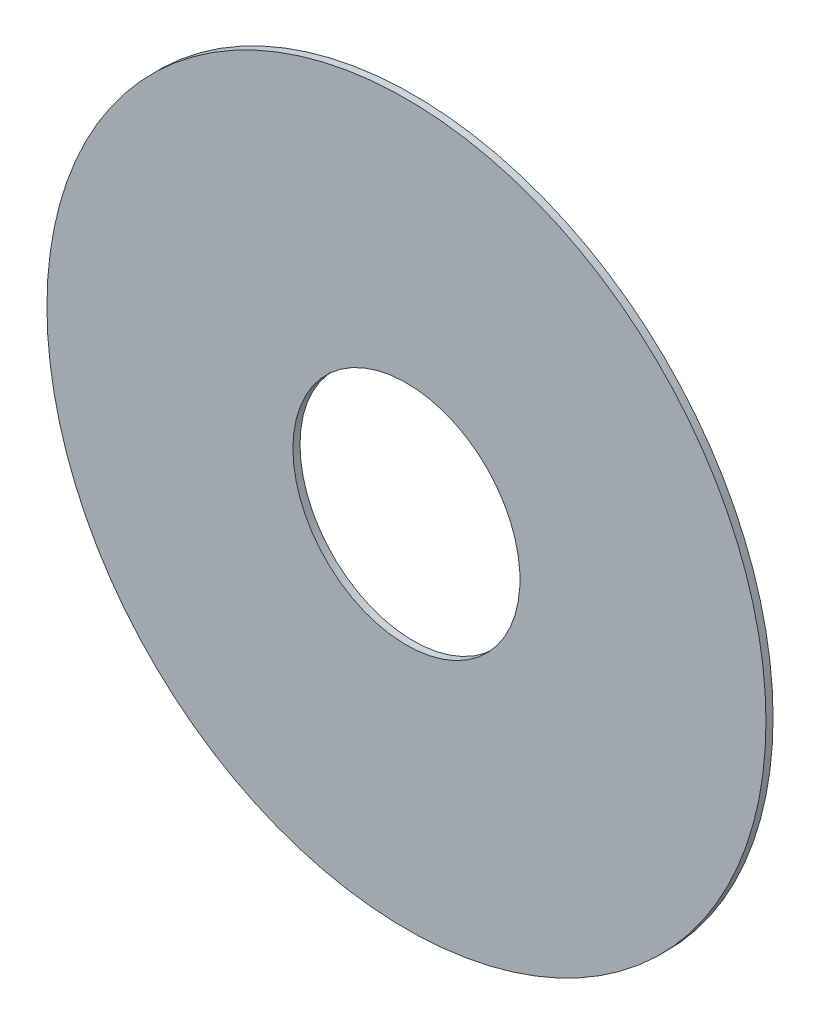
ISO-10303-21;
HEADER;
FILE_DESCRIPTION(('STEP AP214'),'2;1');
FILE_NAME('part.step','',(''),(''),'','','');
FILE_SCHEMA(('AUTOMOTIVE_DESIGN { 1 0 10303 214 1 1 1 1 }'));
ENDSEC;
DATA;
#1=APPLICATION_CONTEXT('core data for automotive mechanical design processes');
#2=APPLICATION_PROTOCOL_DEFINITION('international standard','automotive_design',2000,#1);
#3=PRODUCT_CONTEXT('',#1,'mechanical');
#4=PRODUCT('Part','Part','',(#3));
#5=PRODUCT_RELATED_PRODUCT_CATEGORY('part','',(#4));
#6=PRODUCT_DEFINITION_FORMATION('','',#4);
#7=PRODUCT_DEFINITION_CONTEXT('part definition',#1,'design');
#8=PRODUCT_DEFINITION('design','',#6,#7);
#9=PRODUCT_DEFINITION_SHAPE('','',#8);
#10=(LENGTH_UNIT() NAMED_UNIT(*) SI_UNIT(.MILLI.,.METRE.));
#11=(NAMED_UNIT(*) PLANE_ANGLE_UNIT() SI_UNIT($,.RADIAN.));
#12=(NAMED_UNIT(*) SI_UNIT($,.STERADIAN.) SOLID_ANGLE_UNIT());
#13=UNCERTAINTY_MEASURE_WITH_UNIT(LENGTH_MEASURE(1.E-05),#10,'distance_accuracy_value','');
#14=(GEOMETRIC_REPRESENTATION_CONTEXT(3) GLOBAL_UNCERTAINTY_ASSIGNED_CONTEXT((#13)) GLOBAL_UNIT_ASSIGNED_CONTEXT((#10,
#11,#12)) REPRESENTATION_CONTEXT('',''));
#15=CARTESIAN_POINT('',(0.,0.,0.));
#16=DIRECTION('',(0.,0.,1.));
#17=DIRECTION('',(1.,0.,0.));
#18=AXIS2_PLACEMENT_3D('',#15,#16,#17);
#19=CARTESIAN_POINT('',(0.,0.,4.7625));
#20=DIRECTION('',(0.,0.,1.));
#21=DIRECTION('',(1.,0.,0.));
#22=AXIS2_PLACEMENT_3D('',#19,#20,#21);
#23=PLANE('',#22);
#24=CARTESIAN_POINT('',(0.,0.,4.7625));
#25=DIRECTION('',(0.,0.,1.));
#26=DIRECTION('',(1.,0.,0.));
#27=AXIS2_PLACEMENT_3D('',#24,#25,#26);
#28=CIRCLE('',#27,241.3);
#29=CARTESIAN_POINT('',(-241.3,0.,4.7625));
#30=VERTEX_POINT('',#29);
#31=EDGE_CURVE('E10',#30,#30,#28,.T.);
#32=ORIENTED_EDGE('',*,*,#31,.T.);
#33=EDGE_LOOP('',(#32));
#34=FACE_BOUND('',#33,.T.);
#35=CARTESIAN_POINT('',(0.,0.,4.7625));
#36=DIRECTION('',(0.,0.,1.));
#37=DIRECTION('',(1.,0.,0.));
#38=AXIS2_PLACEMENT_3D('',#35,#36,#37);
#39=CIRCLE('',#38,76.2);
#40=CARTESIAN_POINT('',(-76.2,0.,4.7625));
#41=VERTEX_POINT('',#40);
#42=EDGE_CURVE('E50',#41,#41,#39,.T.);
#43=ORIENTED_EDGE('',*,*,#42,.F.);
#44=EDGE_LOOP('',(#43));
#45=FACE_BOUND('',#44,.T.);
#46=ADVANCED_FACE('F37',(#34,#45),#23,.T.);
#47=CARTESIAN_POINT('',(0.,0.,0.));
#48=DIRECTION('',(0.,0.,1.));
#49=DIRECTION('',(1.,0.,0.));
#50=AXIS2_PLACEMENT_3D('',#47,#48,#49);
#51=PLANE('',#50);
#52=CARTESIAN_POINT('',(0.,0.,0.));
#53=DIRECTION('',(0.,0.,1.));
#54=DIRECTION('',(1.,0.,0.));
#55=AXIS2_PLACEMENT_3D('',#52,#53,#54);
#56=CIRCLE('',#55,241.3);
#57=CARTESIAN_POINT('',(-241.3,0.,0.));
#58=VERTEX_POINT('',#57);
#59=EDGE_CURVE('E41',#58,#58,#56,.T.);
#60=ORIENTED_EDGE('',*,*,#59,.F.);
#61=EDGE_LOOP('',(#60));
#62=FACE_BOUND('',#61,.T.);
#63=CARTESIAN_POINT('',(0.,0.,0.));
#64=DIRECTION('',(0.,0.,1.));
#65=DIRECTION('',(1.,0.,0.));
#66=AXIS2_PLACEMENT_3D('',#63,#64,#65);
#67=CIRCLE('',#66,76.2);
#68=CARTESIAN_POINT('',(-76.2,0.,0.));
#69=VERTEX_POINT('',#68);
#70=EDGE_CURVE('E52',#69,#69,#67,.T.);
#71=ORIENTED_EDGE('',*,*,#70,.T.);
#72=EDGE_LOOP('',(#71));
#73=FACE_BOUND('',#72,.T.);
#74=ADVANCED_FACE('F64',(#62,#73),#51,.F.);
#75=CARTESIAN_POINT('',(0.,0.,4.7625));
#76=DIRECTION('',(0.,0.,-1.));
#77=DIRECTION('',(-1.,0.,0.));
#78=AXIS2_PLACEMENT_3D('',#75,#76,#77);
#79=CYLINDRICAL_SURFACE('',#78,241.3);
#80=CARTESIAN_POINT('',(-241.3,0.,4.7625));
#81=CARTESIAN_POINT('',(-241.3,0.,4.712890625));
#82=CARTESIAN_POINT('',(-241.3,0.,4.66328125));
#83=CARTESIAN_POINT('',(-241.3,0.,4.5640625));
#84=CARTESIAN_POINT('',(-241.3,0.,4.514453125));
#85=CARTESIAN_POINT('',(-241.3,0.,4.415234375));
#86=CARTESIAN_POINT('',(-241.3,0.,4.365625));
#87=CARTESIAN_POINT('',(-241.3,0.,4.26640625));
#88=CARTESIAN_POINT('',(-241.3,0.,4.216796875));
#89=CARTESIAN_POINT('',(-241.3,0.,4.117578125));
#90=CARTESIAN_POINT('',(-241.3,0.,4.06796875));
#91=CARTESIAN_POINT('',(-241.3,0.,3.96875));
#92=CARTESIAN_POINT('',(-241.3,0.,3.919140625));
#93=CARTESIAN_POINT('',(-241.3,0.,3.819921875));
#94=CARTESIAN_POINT('',(-241.3,0.,3.7703125));
#95=CARTESIAN_POINT('',(-241.3,0.,3.67109375));
#96=CARTESIAN_POINT('',(-241.3,0.,3.621484375));
#97=CARTESIAN_POINT('',(-241.3,0.,3.522265625));
#98=CARTESIAN_POINT('',(-241.3,0.,3.47265625));
#99=CARTESIAN_POINT('',(-241.3,0.,3.3734375));
#100=CARTESIAN_POINT('',(-241.3,0.,3.323828125));
#101=CARTESIAN_POINT('',(-241.3,0.,3.224609375));
#102=CARTESIAN_POINT('',(-241.3,0.,3.175));
#103=CARTESIAN_POINT('',(-241.3,0.,3.07578125));
#104=CARTESIAN_POINT('',(-241.3,0.,3.026171875));
#105=CARTESIAN_POINT('',(-241.3,0.,2.926953125));
#106=CARTESIAN_POINT('',(-241.3,0.,2.87734375));
#107=CARTESIAN_POINT('',(-241.3,0.,2.778125));
#108=CARTESIAN_POINT('',(-241.3,0.,2.728515625));
#109=CARTESIAN_POINT('',(-241.3,0.,2.629296875));
#110=CARTESIAN_POINT('',(-241.3,0.,2.5796875));
#111=CARTESIAN_POINT('',(-241.3,0.,2.48046875));
#112=CARTESIAN_POINT('',(-241.3,0.,2.430859375));
#113=CARTESIAN_POINT('',(-241.3,0.,2.331640625));
#114=CARTESIAN_POINT('',(-241.3,0.,2.28203125));
#115=CARTESIAN_POINT('',(-241.3,0.,2.1828125));
#116=CARTESIAN_POINT('',(-241.3,0.,2.133203125));
#117=CARTESIAN_POINT('',(-241.3,0.,2.033984375));
#118=CARTESIAN_POINT('',(-241.3,0.,1.984375));
#119=CARTESIAN_POINT('',(-241.3,0.,1.88515625));
#120=CARTESIAN_POINT('',(-241.3,0.,1.835546875));
#121=CARTESIAN_POINT('',(-241.3,0.,1.736328125));
#122=CARTESIAN_POINT('',(-241.3,0.,1.68671875));
#123=CARTESIAN_POINT('',(-241.3,0.,1.5875));
#124=CARTESIAN_POINT('',(-241.3,0.,1.537890625));
#125=CARTESIAN_POINT('',(-241.3,0.,1.438671875));
#126=CARTESIAN_POINT('',(-241.3,0.,1.3890625));
#127=CARTESIAN_POINT('',(-241.3,0.,1.28984375));
#128=CARTESIAN_POINT('',(-241.3,0.,1.240234375));
#129=CARTESIAN_POINT('',(-241.3,0.,1.141015625));
#130=CARTESIAN_POINT('',(-241.3,0.,1.09140625));
#131=CARTESIAN_POINT('',(-241.3,0.,0.9921875));
#132=CARTESIAN_POINT('',(-241.3,0.,0.942578125));
#133=CARTESIAN_POINT('',(-241.3,0.,0.843359375));
#134=CARTESIAN_POINT('',(-241.3,0.,0.79375));
#135=CARTESIAN_POINT('',(-241.3,0.,0.69453125));
#136=CARTESIAN_POINT('',(-241.3,0.,0.644921875));
#137=CARTESIAN_POINT('',(-241.3,0.,0.545703125));
#138=CARTESIAN_POINT('',(-241.3,0.,0.49609375));
#139=CARTESIAN_POINT('',(-241.3,0.,0.396875));
#140=CARTESIAN_POINT('',(-241.3,0.,0.347265625));
#141=CARTESIAN_POINT('',(-241.3,0.,0.248046875));
#142=CARTESIAN_POINT('',(-241.3,0.,0.1984375));
#143=CARTESIAN_POINT('',(-241.3,0.,0.09921875));
#144=CARTESIAN_POINT('',(-241.3,0.,0.049609375));
#145=CARTESIAN_POINT('',(-241.3,0.,0.));
#146=B_SPLINE_CURVE_WITH_KNOTS('',3,(#80,#81,#82,#83,#84,#85,#86,#87,#88,#89,#90,#91,#92,#93,
#94,#95,#96,#97,#98,#99,#100,#101,#102,#103,#104,#105,#106,#107,#108,#109,#110,#111,#112,#113,
#114,#115,#116,#117,#118,#119,#120,#121,#122,#123,#124,#125,#126,#127,#128,#129,#130,#131,#132,
#133,#134,#135,#136,#137,#138,#139,#140,#141,#142,#143,#144,#145),.UNSPECIFIED.,.F.,.F.,(4,2,2,
2,2,2,2,2,2,2,2,2,2,2,2,2,2,2,2,2,2,2,2,2,2,2,2,2,2,2,2,2,4),(0.,0.148828124999999,
0.297656249999999,0.446484374999999,0.595312499999999,0.744140625,0.89296875,1.041796875,
1.190625,1.339453125,1.48828125,1.637109375,1.7859375,1.934765625,2.08359375,2.232421875,
2.38125,2.530078125,2.67890625,2.827734375,2.9765625,3.125390625,3.27421875,3.423046875,
3.571875,3.720703125,3.86953125,4.018359375,4.1671875,4.316015625,4.46484375,4.613671875,
4.7625),.UNSPECIFIED.);
#147=EDGE_CURVE('BSEAM39',#30,#58,#146,.T.);
#148=ORIENTED_EDGE('',*,*,#31,.F.);
#149=ORIENTED_EDGE('',*,*,#59,.T.);
#150=ORIENTED_EDGE('',*,*,#147,.T.);
#151=ORIENTED_EDGE('',*,*,#147,.F.);
#152=EDGE_LOOP('',(#148,#150,#149,#151));
#153=FACE_BOUND('',#152,.T.);
#154=ADVANCED_FACE('F39',(#153),#79,.T.);
#155=CARTESIAN_POINT('',(0.,0.,4.7625));
#156=DIRECTION('',(0.,0.,-1.));
#157=DIRECTION('',(-1.,0.,0.));
#158=AXIS2_PLACEMENT_3D('',#155,#156,#157);
#159=CYLINDRICAL_SURFACE('',#158,76.2);
#160=CARTESIAN_POINT('',(-76.2,0.,4.7625));
#161=CARTESIAN_POINT('',(-76.2,0.,4.712890625));
#162=CARTESIAN_POINT('',(-76.2,0.,4.66328125));
#163=CARTESIAN_POINT('',(-76.2,0.,4.5640625));
#164=CARTESIAN_POINT('',(-76.2,0.,4.514453125));
#165=CARTESIAN_POINT('',(-76.2,0.,4.415234375));
#166=CARTESIAN_POINT('',(-76.2,0.,4.365625));
#167=CARTESIAN_POINT('',(-76.2,0.,4.26640625));
#168=CARTESIAN_POINT('',(-76.2,0.,4.216796875));
#169=CARTESIAN_POINT('',(-76.2,0.,4.117578125));
#170=CARTESIAN_POINT('',(-76.2,0.,4.06796875));
#171=CARTESIAN_POINT('',(-76.2,0.,3.96875));
#172=CARTESIAN_POINT('',(-76.2,0.,3.919140625));
#173=CARTESIAN_POINT('',(-76.2,0.,3.819921875));
#174=CARTESIAN_POINT('',(-76.2,0.,3.7703125));
#175=CARTESIAN_POINT('',(-76.2,0.,3.67109375));
#176=CARTESIAN_POINT('',(-76.2,0.,3.621484375));
#177=CARTESIAN_POINT('',(-76.2,0.,3.522265625));
#178=CARTESIAN_POINT('',(-76.2,0.,3.47265625));
#179=CARTESIAN_POINT('',(-76.2,0.,3.3734375));
#180=CARTESIAN_POINT('',(-76.2,0.,3.323828125));
#181=CARTESIAN_POINT('',(-76.2,0.,3.224609375));
#182=CARTESIAN_POINT('',(-76.2,0.,3.175));
#183=CARTESIAN_POINT('',(-76.2,0.,3.07578125));
#184=CARTESIAN_POINT('',(-76.2,0.,3.026171875));
#185=CARTESIAN_POINT('',(-76.2,0.,2.926953125));
#186=CARTESIAN_POINT('',(-76.2,0.,2.87734375));
#187=CARTESIAN_POINT('',(-76.2,0.,2.778125));
#188=CARTESIAN_POINT('',(-76.2,0.,2.728515625));
#189=CARTESIAN_POINT('',(-76.2,0.,2.629296875));
#190=CARTESIAN_POINT('',(-76.2,0.,2.5796875));
#191=CARTESIAN_POINT('',(-76.2,0.,2.48046875));
#192=CARTESIAN_POINT('',(-76.2,0.,2.430859375));
#193=CARTESIAN_POINT('',(-76.2,0.,2.331640625));
#194=CARTESIAN_POINT('',(-76.2,0.,2.28203125));
#195=CARTESIAN_POINT('',(-76.2,0.,2.1828125));
#196=CARTESIAN_POINT('',(-76.2,0.,2.133203125));
#197=CARTESIAN_POINT('',(-76.2,0.,2.033984375));
#198=CARTESIAN_POINT('',(-76.2,0.,1.984375));
#199=CARTESIAN_POINT('',(-76.2,0.,1.88515625));
#200=CARTESIAN_POINT('',(-76.2,0.,1.835546875));
#201=CARTESIAN_POINT('',(-76.2,0.,1.736328125));
#202=CARTESIAN_POINT('',(-76.2,0.,1.68671875));
#203=CARTESIAN_POINT('',(-76.2,0.,1.5875));
#204=CARTESIAN_POINT('',(-76.2,0.,1.537890625));
#205=CARTESIAN_POINT('',(-76.2,0.,1.438671875));
#206=CARTESIAN_POINT('',(-76.2,0.,1.3890625));
#207=CARTESIAN_POINT('',(-76.2,0.,1.28984375));
#208=CARTESIAN_POINT('',(-76.2,0.,1.240234375));
#209=CARTESIAN_POINT('',(-76.2,0.,1.141015625));
#210=CARTESIAN_POINT('',(-76.2,0.,1.09140625));
#211=CARTESIAN_POINT('',(-76.2,0.,0.9921875));
#212=CARTESIAN_POINT('',(-76.2,0.,0.942578125));
#213=CARTESIAN_POINT('',(-76.2,0.,0.843359375));
#214=CARTESIAN_POINT('',(-76.2,0.,0.79375));
#215=CARTESIAN_POINT('',(-76.2,0.,0.69453125));
#216=CARTESIAN_POINT('',(-76.2,0.,0.644921875));
#217=CARTESIAN_POINT('',(-76.2,0.,0.545703125));
#218=CARTESIAN_POINT('',(-76.2,0.,0.49609375));
#219=CARTESIAN_POINT('',(-76.2,0.,0.396875));
#220=CARTESIAN_POINT('',(-76.2,0.,0.347265625));
#221=CARTESIAN_POINT('',(-76.2,0.,0.248046875));
#222=CARTESIAN_POINT('',(-76.2,0.,0.1984375));
#223=CARTESIAN_POINT('',(-76.2,0.,0.09921875));
#224=CARTESIAN_POINT('',(-76.2,0.,0.049609375));
#225=CARTESIAN_POINT('',(-76.2,0.,0.));
#226=B_SPLINE_CURVE_WITH_KNOTS('',3,(#160,#161,#162,#163,#164,#165,#166,#167,#168,#169,#170,
#171,#172,#173,#174,#175,#176,#177,#178,#179,#180,#181,#182,#183,#184,#185,#186,#187,#188,#189,
#190,#191,#192,#193,#194,#195,#196,#197,#198,#199,#200,#201,#202,#203,#204,#205,#206,#207,#208,
#209,#210,#211,#212,#213,#214,#215,#216,#217,#218,#219,#220,#221,#222,#223,#224,#225),
.UNSPECIFIED.,.F.,.F.,(4,2,2,2,2,2,2,2,2,2,2,2,2,2,2,2,2,2,2,2,2,2,2,2,2,2,2,2,2,2,2,2,4),(0.,
0.148828124999999,0.297656249999999,0.446484374999999,0.595312499999999,0.744140625,0.89296875,
1.041796875,1.190625,1.339453125,1.48828125,1.637109375,1.7859375,1.934765625,2.08359375,
2.232421875,2.38125,2.530078125,2.67890625,2.827734375,2.9765625,3.125390625,3.27421875,
3.423046875,3.571875,3.720703125,3.86953125,4.018359375,4.1671875,4.316015625,4.46484375,
4.613671875,4.7625),.UNSPECIFIED.);
#227=EDGE_CURVE('BSEAM60',#41,#69,#226,.T.);
#228=ORIENTED_EDGE('',*,*,#42,.T.);
#229=ORIENTED_EDGE('',*,*,#70,.F.);
#230=ORIENTED_EDGE('',*,*,#227,.T.);
#231=ORIENTED_EDGE('',*,*,#227,.F.);
#232=EDGE_LOOP('',(#228,#230,#229,#231));
#233=FACE_BOUND('',#232,.T.);
#234=ADVANCED_FACE('F60',(#233),#159,.F.);
#235=CLOSED_SHELL('',(#46,#74,#154,#234));
#236=MANIFOLD_SOLID_BREP('B2',#235);
#237=ADVANCED_BREP_SHAPE_REPRESENTATION('',(#18,#236),#14);
#238=SHAPE_DEFINITION_REPRESENTATION(#9,#237);
ENDSEC;
END-ISO-10303-21;
